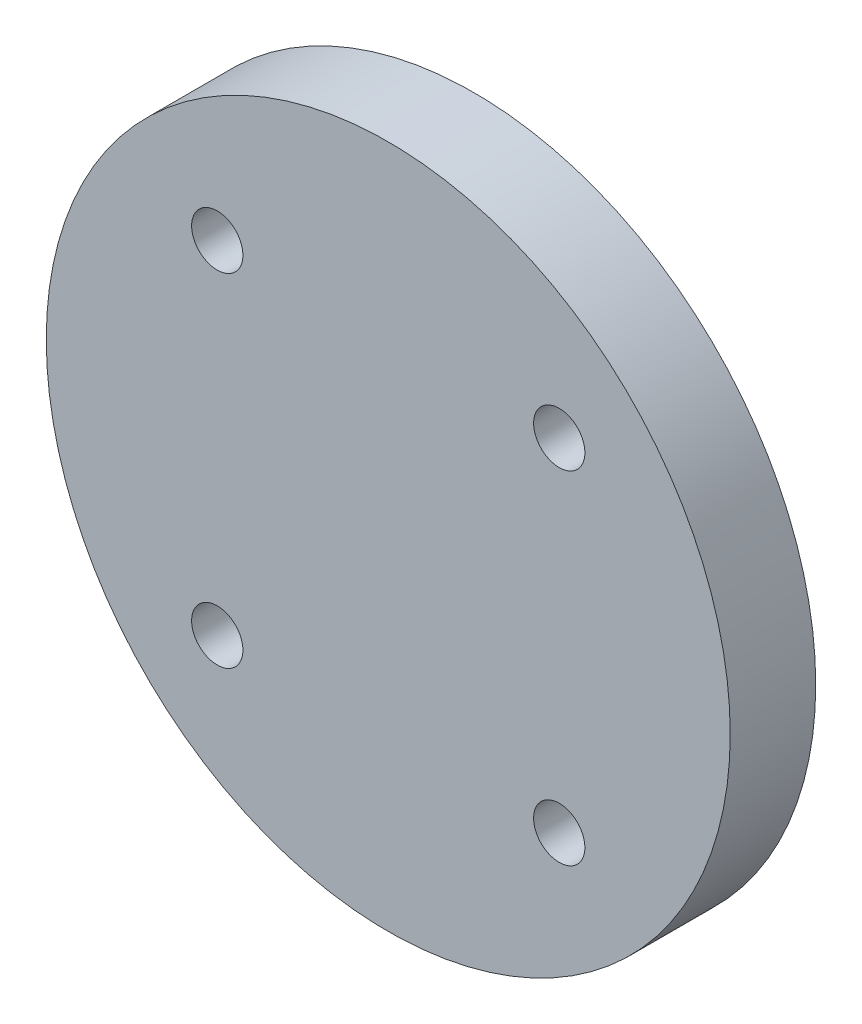
ISO-10303-21;
HEADER;
FILE_DESCRIPTION(('STEP AP214'),'2;1');
FILE_NAME('part.step','',(''),(''),'','','');
FILE_SCHEMA(('AUTOMOTIVE_DESIGN { 1 0 10303 214 1 1 1 1 }'));
ENDSEC;
DATA;
#1=APPLICATION_CONTEXT('core data for automotive mechanical design processes');
#2=APPLICATION_PROTOCOL_DEFINITION('international standard','automotive_design',2000,#1);
#3=PRODUCT_CONTEXT('',#1,'mechanical');
#4=PRODUCT('Part','Part','',(#3));
#5=PRODUCT_RELATED_PRODUCT_CATEGORY('part','',(#4));
#6=PRODUCT_DEFINITION_FORMATION('','',#4);
#7=PRODUCT_DEFINITION_CONTEXT('part definition',#1,'design');
#8=PRODUCT_DEFINITION('design','',#6,#7);
#9=PRODUCT_DEFINITION_SHAPE('','',#8);
#10=(LENGTH_UNIT() NAMED_UNIT(*) SI_UNIT(.MILLI.,.METRE.));
#11=(NAMED_UNIT(*) PLANE_ANGLE_UNIT() SI_UNIT($,.RADIAN.));
#12=(NAMED_UNIT(*) SI_UNIT($,.STERADIAN.) SOLID_ANGLE_UNIT());
#13=UNCERTAINTY_MEASURE_WITH_UNIT(LENGTH_MEASURE(1.E-05),#10,'distance_accuracy_value','');
#14=(GEOMETRIC_REPRESENTATION_CONTEXT(3) GLOBAL_UNCERTAINTY_ASSIGNED_CONTEXT((#13)) GLOBAL_UNIT_ASSIGNED_CONTEXT((#10,
#11,#12)) REPRESENTATION_CONTEXT('',''));
#15=CARTESIAN_POINT('',(0.,0.,0.));
#16=DIRECTION('',(0.,0.,1.));
#17=DIRECTION('',(1.,0.,0.));
#18=AXIS2_PLACEMENT_3D('',#15,#16,#17);
#19=CARTESIAN_POINT('',(0.,0.,5.));
#20=DIRECTION('',(0.,0.,1.));
#21=DIRECTION('',(1.,0.,0.));
#22=AXIS2_PLACEMENT_3D('',#19,#20,#21);
#23=PLANE('',#22);
#24=CARTESIAN_POINT('',(10.,10.,5.));
#25=DIRECTION('',(0.,0.,1.));
#26=DIRECTION('',(1.,0.,0.));
#27=AXIS2_PLACEMENT_3D('',#24,#25,#26);
#28=CIRCLE('',#27,1.5);
#29=CARTESIAN_POINT('',(11.5,10.,5.));
#30=VERTEX_POINT('',#29);
#31=EDGE_CURVE('E53',#30,#30,#28,.T.);
#32=ORIENTED_EDGE('',*,*,#31,.F.);
#33=EDGE_LOOP('',(#32));
#34=FACE_BOUND('',#33,.T.);
#35=CARTESIAN_POINT('',(-10.,-10.,5.));
#36=DIRECTION('',(0.,0.,1.));
#37=DIRECTION('',(1.,0.,0.));
#38=AXIS2_PLACEMENT_3D('',#35,#36,#37);
#39=CIRCLE('',#38,1.5);
#40=CARTESIAN_POINT('',(-8.5,-10.,5.));
#41=VERTEX_POINT('',#40);
#42=EDGE_CURVE('E42',#41,#41,#39,.T.);
#43=ORIENTED_EDGE('',*,*,#42,.F.);
#44=EDGE_LOOP('',(#43));
#45=FACE_BOUND('',#44,.T.);
#46=CARTESIAN_POINT('',(0.,0.,5.));
#47=DIRECTION('',(0.,0.,1.));
#48=DIRECTION('',(1.,0.,0.));
#49=AXIS2_PLACEMENT_3D('',#46,#47,#48);
#50=CIRCLE('',#49,20.);
#51=CARTESIAN_POINT('',(20.,0.,5.));
#52=VERTEX_POINT('',#51);
#53=EDGE_CURVE('E10',#52,#52,#50,.T.);
#54=ORIENTED_EDGE('',*,*,#53,.T.);
#55=EDGE_LOOP('',(#54));
#56=FACE_BOUND('',#55,.T.);
#57=CARTESIAN_POINT('',(-10.,10.,5.));
#58=DIRECTION('',(0.,0.,1.));
#59=DIRECTION('',(-1.,0.,0.));
#60=AXIS2_PLACEMENT_3D('',#57,#58,#59);
#61=CIRCLE('',#60,1.5);
#62=CARTESIAN_POINT('',(-11.5,10.,5.));
#63=VERTEX_POINT('',#62);
#64=EDGE_CURVE('E47',#63,#63,#61,.T.);
#65=ORIENTED_EDGE('',*,*,#64,.F.);
#66=EDGE_LOOP('',(#65));
#67=FACE_BOUND('',#66,.T.);
#68=CARTESIAN_POINT('',(10.,-10.,5.));
#69=DIRECTION('',(0.,0.,1.));
#70=DIRECTION('',(-1.,0.,0.));
#71=AXIS2_PLACEMENT_3D('',#68,#69,#70);
#72=CIRCLE('',#71,1.5);
#73=CARTESIAN_POINT('',(8.5,-10.,5.));
#74=VERTEX_POINT('',#73);
#75=EDGE_CURVE('E59',#74,#74,#72,.T.);
#76=ORIENTED_EDGE('',*,*,#75,.F.);
#77=EDGE_LOOP('',(#76));
#78=FACE_BOUND('',#77,.T.);
#79=ADVANCED_FACE('F31',(#34,#45,#56,#67,#78),#23,.T.);
#80=CARTESIAN_POINT('',(0.,0.,0.));
#81=DIRECTION('',(0.,0.,1.));
#82=DIRECTION('',(1.,0.,0.));
#83=AXIS2_PLACEMENT_3D('',#80,#81,#82);
#84=PLANE('',#83);
#85=CARTESIAN_POINT('',(10.,10.,0.));
#86=DIRECTION('',(0.,0.,1.));
#87=DIRECTION('',(1.,0.,0.));
#88=AXIS2_PLACEMENT_3D('',#85,#86,#87);
#89=CIRCLE('',#88,1.5);
#90=CARTESIAN_POINT('',(11.5,10.,0.));
#91=VERTEX_POINT('',#90);
#92=EDGE_CURVE('E56',#91,#91,#89,.T.);
#93=ORIENTED_EDGE('',*,*,#92,.T.);
#94=EDGE_LOOP('',(#93));
#95=FACE_BOUND('',#94,.T.);
#96=CARTESIAN_POINT('',(-10.,-10.,0.));
#97=DIRECTION('',(0.,0.,1.));
#98=DIRECTION('',(1.,0.,0.));
#99=AXIS2_PLACEMENT_3D('',#96,#97,#98);
#100=CIRCLE('',#99,1.5);
#101=CARTESIAN_POINT('',(-8.5,-10.,0.));
#102=VERTEX_POINT('',#101);
#103=EDGE_CURVE('E44',#102,#102,#100,.T.);
#104=ORIENTED_EDGE('',*,*,#103,.T.);
#105=EDGE_LOOP('',(#104));
#106=FACE_BOUND('',#105,.T.);
#107=CARTESIAN_POINT('',(0.,0.,0.));
#108=DIRECTION('',(0.,0.,1.));
#109=DIRECTION('',(1.,0.,0.));
#110=AXIS2_PLACEMENT_3D('',#107,#108,#109);
#111=CIRCLE('',#110,20.);
#112=CARTESIAN_POINT('',(20.,0.,0.));
#113=VERTEX_POINT('',#112);
#114=EDGE_CURVE('E35',#113,#113,#111,.T.);
#115=ORIENTED_EDGE('',*,*,#114,.F.);
#116=EDGE_LOOP('',(#115));
#117=FACE_BOUND('',#116,.T.);
#118=CARTESIAN_POINT('',(-10.,10.,0.));
#119=DIRECTION('',(0.,0.,1.));
#120=DIRECTION('',(-1.,0.,0.));
#121=AXIS2_PLACEMENT_3D('',#118,#119,#120);
#122=CIRCLE('',#121,1.5);
#123=CARTESIAN_POINT('',(-11.5,10.,0.));
#124=VERTEX_POINT('',#123);
#125=EDGE_CURVE('E50',#124,#124,#122,.T.);
#126=ORIENTED_EDGE('',*,*,#125,.T.);
#127=EDGE_LOOP('',(#126));
#128=FACE_BOUND('',#127,.T.);
#129=CARTESIAN_POINT('',(10.,-10.,0.));
#130=DIRECTION('',(0.,0.,1.));
#131=DIRECTION('',(-1.,0.,0.));
#132=AXIS2_PLACEMENT_3D('',#129,#130,#131);
#133=CIRCLE('',#132,1.5);
#134=CARTESIAN_POINT('',(8.5,-10.,0.));
#135=VERTEX_POINT('',#134);
#136=EDGE_CURVE('E62',#135,#135,#133,.T.);
#137=ORIENTED_EDGE('',*,*,#136,.T.);
#138=EDGE_LOOP('',(#137));
#139=FACE_BOUND('',#138,.T.);
#140=ADVANCED_FACE('F72',(#95,#106,#117,#128,#139),#84,.F.);
#141=CARTESIAN_POINT('',(0.,0.,5.));
#142=DIRECTION('',(0.,0.,-1.));
#143=DIRECTION('',(-1.,0.,0.));
#144=AXIS2_PLACEMENT_3D('',#141,#142,#143);
#145=CYLINDRICAL_SURFACE('',#144,20.);
#146=ORIENTED_EDGE('',*,*,#53,.F.);
#147=EDGE_LOOP('',(#146));
#148=FACE_BOUND('',#147,.T.);
#149=ORIENTED_EDGE('',*,*,#114,.T.);
#150=EDGE_LOOP('',(#149));
#151=FACE_BOUND('',#150,.T.);
#152=ADVANCED_FACE('F33',(#148,#151),#145,.T.);
#153=CARTESIAN_POINT('',(-10.,-10.,5.));
#154=DIRECTION('',(0.,0.,-1.));
#155=DIRECTION('',(-1.,0.,0.));
#156=AXIS2_PLACEMENT_3D('',#153,#154,#155);
#157=CYLINDRICAL_SURFACE('',#156,1.5);
#158=ORIENTED_EDGE('',*,*,#42,.T.);
#159=EDGE_LOOP('',(#158));
#160=FACE_BOUND('',#159,.T.);
#161=ORIENTED_EDGE('',*,*,#103,.F.);
#162=EDGE_LOOP('',(#161));
#163=FACE_BOUND('',#162,.T.);
#164=ADVANCED_FACE('F82',(#160,#163),#157,.F.);
#165=CARTESIAN_POINT('',(-10.,10.,5.));
#166=DIRECTION('',(0.,0.,-1.));
#167=DIRECTION('',(-1.,0.,0.));
#168=AXIS2_PLACEMENT_3D('',#165,#166,#167);
#169=CYLINDRICAL_SURFACE('',#168,1.5);
#170=ORIENTED_EDGE('',*,*,#64,.T.);
#171=EDGE_LOOP('',(#170));
#172=FACE_BOUND('',#171,.T.);
#173=ORIENTED_EDGE('',*,*,#125,.F.);
#174=EDGE_LOOP('',(#173));
#175=FACE_BOUND('',#174,.T.);
#176=ADVANCED_FACE('F85',(#172,#175),#169,.F.);
#177=CARTESIAN_POINT('',(10.,10.,5.));
#178=DIRECTION('',(0.,0.,-1.));
#179=DIRECTION('',(-1.,0.,0.));
#180=AXIS2_PLACEMENT_3D('',#177,#178,#179);
#181=CYLINDRICAL_SURFACE('',#180,1.5);
#182=ORIENTED_EDGE('',*,*,#31,.T.);
#183=EDGE_LOOP('',(#182));
#184=FACE_BOUND('',#183,.T.);
#185=ORIENTED_EDGE('',*,*,#92,.F.);
#186=EDGE_LOOP('',(#185));
#187=FACE_BOUND('',#186,.T.);
#188=ADVANCED_FACE('F89',(#184,#187),#181,.F.);
#189=CARTESIAN_POINT('',(10.,-10.,5.));
#190=DIRECTION('',(0.,0.,-1.));
#191=DIRECTION('',(-1.,0.,0.));
#192=AXIS2_PLACEMENT_3D('',#189,#190,#191);
#193=CYLINDRICAL_SURFACE('',#192,1.5);
#194=ORIENTED_EDGE('',*,*,#75,.T.);
#195=EDGE_LOOP('',(#194));
#196=FACE_BOUND('',#195,.T.);
#197=ORIENTED_EDGE('',*,*,#136,.F.);
#198=EDGE_LOOP('',(#197));
#199=FACE_BOUND('',#198,.T.);
#200=ADVANCED_FACE('F68',(#196,#199),#193,.F.);
#201=CLOSED_SHELL('',(#79,#140,#152,#164,#176,#188,#200));
#202=MANIFOLD_SOLID_BREP('B2',#201);
#203=ADVANCED_BREP_SHAPE_REPRESENTATION('',(#18,#202),#14);
#204=SHAPE_DEFINITION_REPRESENTATION(#9,#203);
ENDSEC;
END-ISO-10303-21;
